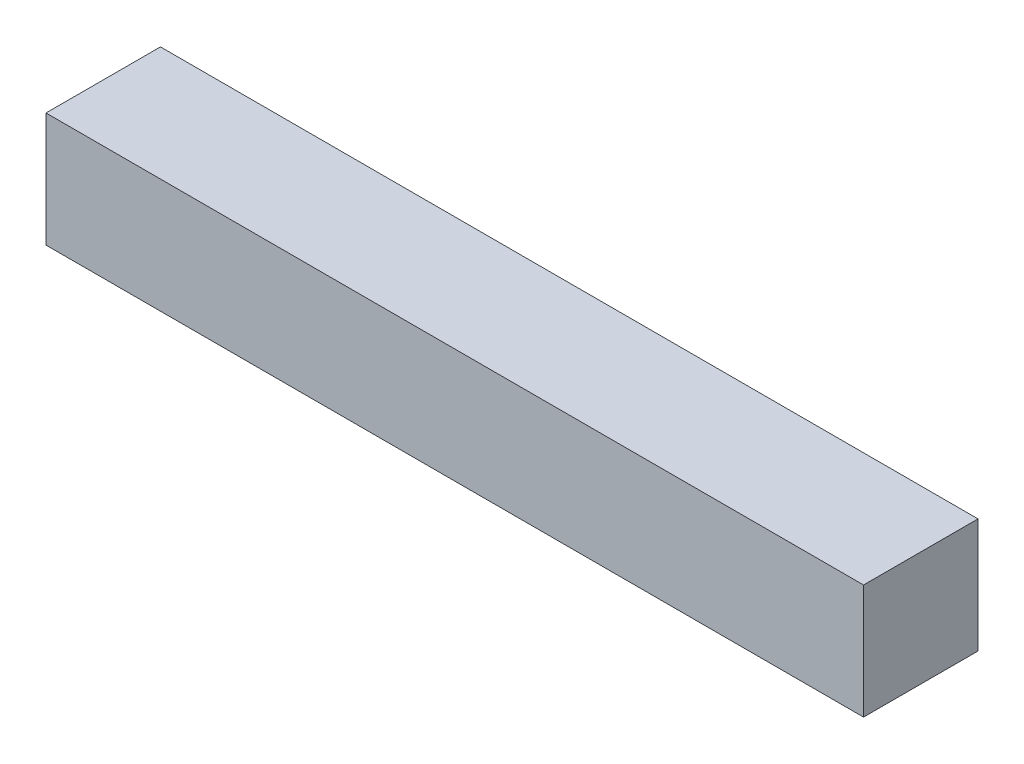
ISO-10303-21;
HEADER;
FILE_DESCRIPTION(('STEP AP214'),'2;1');
FILE_NAME('part.step','',(''),(''),'','','');
FILE_SCHEMA(('AUTOMOTIVE_DESIGN { 1 0 10303 214 1 1 1 1 }'));
ENDSEC;
DATA;
#1=APPLICATION_CONTEXT('core data for automotive mechanical design processes');
#2=APPLICATION_PROTOCOL_DEFINITION('international standard','automotive_design',2000,#1);
#3=PRODUCT_CONTEXT('',#1,'mechanical');
#4=PRODUCT('Part','Part','',(#3));
#5=PRODUCT_RELATED_PRODUCT_CATEGORY('part','',(#4));
#6=PRODUCT_DEFINITION_FORMATION('','',#4);
#7=PRODUCT_DEFINITION_CONTEXT('part definition',#1,'design');
#8=PRODUCT_DEFINITION('design','',#6,#7);
#9=PRODUCT_DEFINITION_SHAPE('','',#8);
#10=(LENGTH_UNIT() NAMED_UNIT(*) SI_UNIT(.MILLI.,.METRE.));
#11=(NAMED_UNIT(*) PLANE_ANGLE_UNIT() SI_UNIT($,.RADIAN.));
#12=(NAMED_UNIT(*) SI_UNIT($,.STERADIAN.) SOLID_ANGLE_UNIT());
#13=UNCERTAINTY_MEASURE_WITH_UNIT(LENGTH_MEASURE(1.E-05),#10,'distance_accuracy_value','');
#14=(GEOMETRIC_REPRESENTATION_CONTEXT(3) GLOBAL_UNCERTAINTY_ASSIGNED_CONTEXT((#13)) GLOBAL_UNIT_ASSIGNED_CONTEXT((#10,
#11,#12)) REPRESENTATION_CONTEXT('',''));
#15=CARTESIAN_POINT('',(0.,0.,0.));
#16=DIRECTION('',(0.,0.,1.));
#17=DIRECTION('',(1.,0.,0.));
#18=AXIS2_PLACEMENT_3D('',#15,#16,#17);
#19=CARTESIAN_POINT('',(-15000.,7000.,7000.));
#20=DIRECTION('',(1.,0.,0.));
#21=DIRECTION('',(0.,0.,-1.));
#22=AXIS2_PLACEMENT_3D('',#19,#20,#21);
#23=PLANE('',#22);
#24=DIRECTION('',(0.,-1.,0.));
#25=VECTOR('',#24,1.);
#26=CARTESIAN_POINT('',(-15000.,7000.,0.));
#27=LINE('',#26,#25);
#28=CARTESIAN_POINT('',(-15000.,7000.,0.));
#29=VERTEX_POINT('',#28);
#30=CARTESIAN_POINT('',(-15000.,0.,0.));
#31=VERTEX_POINT('',#30);
#32=EDGE_CURVE('E271',#29,#31,#27,.T.);
#33=ORIENTED_EDGE('',*,*,#32,.T.);
#34=DIRECTION('',(0.,0.,-1.));
#35=VECTOR('',#34,1.);
#36=CARTESIAN_POINT('',(-15000.,0.,7000.));
#37=LINE('',#36,#35);
#38=CARTESIAN_POINT('',(-15000.,0.,7000.));
#39=VERTEX_POINT('',#38);
#40=EDGE_CURVE('E350',#39,#31,#37,.T.);
#41=ORIENTED_EDGE('',*,*,#40,.F.);
#42=DIRECTION('',(0.,-1.,0.));
#43=VECTOR('',#42,1.);
#44=CARTESIAN_POINT('',(-15000.,7000.,7000.));
#45=LINE('',#44,#43);
#46=CARTESIAN_POINT('',(-15000.,7000.,7000.));
#47=VERTEX_POINT('',#46);
#48=EDGE_CURVE('E275',#47,#39,#45,.T.);
#49=ORIENTED_EDGE('',*,*,#48,.F.);
#50=DIRECTION('',(0.,0.,-1.));
#51=VECTOR('',#50,1.);
#52=CARTESIAN_POINT('',(-15000.,7000.,7000.));
#53=LINE('',#52,#51);
#54=EDGE_CURVE('E346',#47,#29,#53,.T.);
#55=ORIENTED_EDGE('',*,*,#54,.T.);
#56=EDGE_LOOP('',(#33,#41,#49,#55));
#57=FACE_BOUND('',#56,.T.);
#58=ADVANCED_FACE('F50',(#57),#23,.F.);
#59=CARTESIAN_POINT('',(-15000.,0.,7000.));
#60=DIRECTION('',(0.,1.,0.));
#61=DIRECTION('',(0.,0.,1.));
#62=AXIS2_PLACEMENT_3D('',#59,#60,#61);
#63=PLANE('',#62);
#64=DIRECTION('',(1.,0.,0.));
#65=VECTOR('',#64,1.);
#66=CARTESIAN_POINT('',(-15000.,0.,0.));
#67=LINE('',#66,#65);
#68=CARTESIAN_POINT('',(35000.,0.,0.));
#69=VERTEX_POINT('',#68);
#70=EDGE_CURVE('E348',#31,#69,#67,.T.);
#71=ORIENTED_EDGE('',*,*,#70,.T.);
#72=DIRECTION('',(0.,0.,-1.));
#73=VECTOR('',#72,1.);
#74=CARTESIAN_POINT('',(35000.,0.,7000.));
#75=LINE('',#74,#73);
#76=CARTESIAN_POINT('',(35000.,0.,7000.));
#77=VERTEX_POINT('',#76);
#78=EDGE_CURVE('E362',#77,#69,#75,.T.);
#79=ORIENTED_EDGE('',*,*,#78,.F.);
#80=DIRECTION('',(1.,0.,0.));
#81=VECTOR('',#80,1.);
#82=CARTESIAN_POINT('',(-15000.,0.,7000.));
#83=LINE('',#82,#81);
#84=EDGE_CURVE('E97',#39,#77,#83,.T.);
#85=ORIENTED_EDGE('',*,*,#84,.F.);
#86=ORIENTED_EDGE('',*,*,#40,.T.);
#87=EDGE_LOOP('',(#71,#79,#85,#86));
#88=FACE_BOUND('',#87,.T.);
#89=ADVANCED_FACE('F340',(#88),#63,.F.);
#90=CARTESIAN_POINT('',(35000.,0.,7000.));
#91=DIRECTION('',(-1.,0.,0.));
#92=DIRECTION('',(0.,0.,1.));
#93=AXIS2_PLACEMENT_3D('',#90,#91,#92);
#94=PLANE('',#93);
#95=DIRECTION('',(0.,1.,0.));
#96=VECTOR('',#95,1.);
#97=CARTESIAN_POINT('',(35000.,0.,0.));
#98=LINE('',#97,#96);
#99=CARTESIAN_POINT('',(35000.,7000.,0.));
#100=VERTEX_POINT('',#99);
#101=EDGE_CURVE('E355',#69,#100,#98,.T.);
#102=ORIENTED_EDGE('',*,*,#101,.T.);
#103=DIRECTION('',(0.,0.,-1.));
#104=VECTOR('',#103,1.);
#105=CARTESIAN_POINT('',(35000.,7000.,7000.));
#106=LINE('',#105,#104);
#107=CARTESIAN_POINT('',(35000.,7000.,7000.));
#108=VERTEX_POINT('',#107);
#109=EDGE_CURVE('E359',#108,#100,#106,.T.);
#110=ORIENTED_EDGE('',*,*,#109,.F.);
#111=DIRECTION('',(0.,1.,0.));
#112=VECTOR('',#111,1.);
#113=CARTESIAN_POINT('',(35000.,0.,7000.));
#114=LINE('',#113,#112);
#115=EDGE_CURVE('E549',#77,#108,#114,.T.);
#116=ORIENTED_EDGE('',*,*,#115,.F.);
#117=ORIENTED_EDGE('',*,*,#78,.T.);
#118=EDGE_LOOP('',(#102,#110,#116,#117));
#119=FACE_BOUND('',#118,.T.);
#120=ADVANCED_FACE('F345',(#119),#94,.F.);
#121=CARTESIAN_POINT('',(35000.,7000.,7000.));
#122=DIRECTION('',(0.,-1.,0.));
#123=DIRECTION('',(0.,0.,-1.));
#124=AXIS2_PLACEMENT_3D('',#121,#122,#123);
#125=PLANE('',#124);
#126=DIRECTION('',(-1.,0.,0.));
#127=VECTOR('',#126,1.);
#128=CARTESIAN_POINT('',(35000.,7000.,0.));
#129=LINE('',#128,#127);
#130=EDGE_CURVE('E93',#100,#29,#129,.T.);
#131=ORIENTED_EDGE('',*,*,#130,.T.);
#132=ORIENTED_EDGE('',*,*,#54,.F.);
#133=DIRECTION('',(-1.,0.,0.));
#134=VECTOR('',#133,1.);
#135=CARTESIAN_POINT('',(35000.,7000.,7000.));
#136=LINE('',#135,#134);
#137=EDGE_CURVE('E69',#108,#47,#136,.T.);
#138=ORIENTED_EDGE('',*,*,#137,.F.);
#139=ORIENTED_EDGE('',*,*,#109,.T.);
#140=EDGE_LOOP('',(#131,#132,#138,#139));
#141=FACE_BOUND('',#140,.T.);
#142=ADVANCED_FACE('F516',(#141),#125,.F.);
#143=CARTESIAN_POINT('',(0.,0.,7000.));
#144=DIRECTION('',(0.,0.,1.));
#145=DIRECTION('',(1.,0.,0.));
#146=AXIS2_PLACEMENT_3D('',#143,#144,#145);
#147=PLANE('',#146);
#148=ORIENTED_EDGE('',*,*,#48,.T.);
#149=ORIENTED_EDGE('',*,*,#84,.T.);
#150=ORIENTED_EDGE('',*,*,#115,.T.);
#151=ORIENTED_EDGE('',*,*,#137,.T.);
#152=EDGE_LOOP('',(#148,#149,#150,#151));
#153=FACE_BOUND('',#152,.T.);
#154=ADVANCED_FACE('F510',(#153),#147,.T.);
#155=CARTESIAN_POINT('',(0.,0.,0.));
#156=DIRECTION('',(0.,0.,1.));
#157=DIRECTION('',(1.,0.,0.));
#158=AXIS2_PLACEMENT_3D('',#155,#156,#157);
#159=PLANE('',#158);
#160=DIRECTION('',(-0.970201559796527,-0.242299264069014,0.));
#161=VECTOR('',#160,1.);
#162=CARTESIAN_POINT('',(-105.785605771789,423.580979984227,0.));
#163=LINE('',#162,#161);
#164=CARTESIAN_POINT('',(1282.13370336686,770.201559796526,0.));
#165=VERTEX_POINT('',#164);
#166=CARTESIAN_POINT('',(113.655110389649,478.384359236518,0.));
#167=VERTEX_POINT('',#166);
#168=EDGE_CURVE('E386',#165,#167,#163,.T.);
#169=ORIENTED_EDGE('',*,*,#168,.T.);
#170=CARTESIAN_POINT('',(150.,332.854125267039,0.));
#171=DIRECTION('',(0.,0.,1.));
#172=DIRECTION('',(1.,0.,0.));
#173=AXIS2_PLACEMENT_3D('',#170,#171,#172);
#174=CIRCLE('',#173,150.);
#175=CARTESIAN_POINT('',(88.915850741552,469.853127852355,0.));
#176=VERTEX_POINT('',#175);
#177=EDGE_CURVE('E11',#167,#176,#174,.T.);
#178=ORIENTED_EDGE('',*,*,#177,.T.);
#179=DIRECTION('',(0.,-1.,0.));
#180=VECTOR('',#179,1.);
#181=CARTESIAN_POINT('',(88.915850741552,800.,0.));
#182=LINE('',#181,#180);
#183=CARTESIAN_POINT('',(88.915850741552,163.000997414683,0.));
#184=VERTEX_POINT('',#183);
#185=EDGE_CURVE('E53',#184,#176,#182,.F.);
#186=ORIENTED_EDGE('',*,*,#185,.F.);
#187=CARTESIAN_POINT('',(150.,300.,0.));
#188=DIRECTION('',(0.,0.,1.));
#189=DIRECTION('',(1.,0.,0.));
#190=AXIS2_PLACEMENT_3D('',#187,#188,#189);
#191=CIRCLE('',#190,150.);
#192=CARTESIAN_POINT('',(150.,150.,0.));
#193=VERTEX_POINT('',#192);
#194=EDGE_CURVE('E384',#184,#193,#191,.T.);
#195=ORIENTED_EDGE('',*,*,#194,.T.);
#196=DIRECTION('',(1.,0.,0.));
#197=VECTOR('',#196,1.);
#198=CARTESIAN_POINT('',(0.,150.,0.));
#199=LINE('',#198,#197);
#200=CARTESIAN_POINT('',(2183.17892984684,150.,0.));
#201=VERTEX_POINT('',#200);
#202=EDGE_CURVE('E385',#193,#201,#199,.T.);
#203=ORIENTED_EDGE('',*,*,#202,.T.);
#204=CARTESIAN_POINT('',(2183.17892984684,3150.,0.));
#205=DIRECTION('',(0.,0.,1.));
#206=DIRECTION('',(1.,0.,0.));
#207=AXIS2_PLACEMENT_3D('',#204,#205,#206);
#208=CIRCLE('',#207,3000.);
#209=CARTESIAN_POINT('',(2419.35599110079,159.311049985732,0.));
#210=VERTEX_POINT('',#209);
#211=EDGE_CURVE('E377',#201,#210,#208,.T.);
#212=ORIENTED_EDGE('',*,*,#211,.T.);
#213=DIRECTION('',(0.996896316671423,0.0787256870846493,0.));
#214=VECTOR('',#213,1.);
#215=CARTESIAN_POINT('',(2.49157854542202,-31.5506357151004,0.));
#216=LINE('',#215,#214);
#217=CARTESIAN_POINT('',(4876.24751038483,353.333707822309,0.));
#218=VERTEX_POINT('',#217);
#219=EDGE_CURVE('E376',#210,#218,#216,.T.);
#220=ORIENTED_EDGE('',*,*,#219,.T.);
#221=DIRECTION('',(0.,-1.,0.));
#222=VECTOR('',#221,1.);
#223=CARTESIAN_POINT('',(4876.24751038483,800.,0.));
#224=LINE('',#223,#222);
#225=CARTESIAN_POINT('',(4876.24751038483,393.333556509006,0.));
#226=VERTEX_POINT('',#225);
#227=EDGE_CURVE('E372',#226,#218,#224,.T.);
#228=ORIENTED_EDGE('',*,*,#227,.F.);
#229=DIRECTION('',(-0.987755894538212,0.156007348560948,0.));
#230=VECTOR('',#229,1.);
#231=CARTESIAN_POINT('',(179.291130820283,1135.17647046587,0.));
#232=LINE('',#231,#230);
#233=CARTESIAN_POINT('',(2456.49738024797,775.511789076423,0.));
#234=VERTEX_POINT('',#233);
#235=EDGE_CURVE('E369',#226,#234,#232,.T.);
#236=ORIENTED_EDGE('',*,*,#235,.T.);
#237=CARTESIAN_POINT('',(2144.48268312607,-1200.,0.));
#238=DIRECTION('',(0.,0.,1.));
#239=DIRECTION('',(1.,0.,0.));
#240=AXIS2_PLACEMENT_3D('',#237,#238,#239);
#241=CIRCLE('',#240,2000.);
#242=CARTESIAN_POINT('',(2144.48268312607,800.,0.));
#243=VERTEX_POINT('',#242);
#244=EDGE_CURVE('E368',#234,#243,#241,.T.);
#245=ORIENTED_EDGE('',*,*,#244,.T.);
#246=DIRECTION('',(-1.,0.,0.));
#247=VECTOR('',#246,1.);
#248=CARTESIAN_POINT('',(0.,800.,0.));
#249=LINE('',#248,#247);
#250=CARTESIAN_POINT('',(1524.43296743589,800.,0.));
#251=VERTEX_POINT('',#250);
#252=EDGE_CURVE('E375',#243,#251,#249,.T.);
#253=ORIENTED_EDGE('',*,*,#252,.T.);
#254=CARTESIAN_POINT('',(1524.43296743588,-200.,0.));
#255=DIRECTION('',(0.,0.,1.));
#256=DIRECTION('',(1.,0.,0.));
#257=AXIS2_PLACEMENT_3D('',#254,#255,#256);
#258=CIRCLE('',#257,1000.);
#259=EDGE_CURVE('E213',#251,#165,#258,.T.);
#260=ORIENTED_EDGE('',*,*,#259,.T.);
#261=EDGE_LOOP('',(#169,#178,#186,#195,#203,#212,#220,#228,#236,#245,#253,#260));
#262=FACE_BOUND('',#261,.T.);
#263=ORIENTED_EDGE('',*,*,#32,.F.);
#264=ORIENTED_EDGE('',*,*,#130,.F.);
#265=ORIENTED_EDGE('',*,*,#101,.F.);
#266=ORIENTED_EDGE('',*,*,#70,.F.);
#267=EDGE_LOOP('',(#263,#264,#265,#266));
#268=FACE_BOUND('',#267,.T.);
#269=ADVANCED_FACE('F402',(#262,#268),#159,.F.);
#270=CARTESIAN_POINT('',(248.915850741552,800.,0.));
#271=DIRECTION('',(0.,-1.,0.));
#272=DIRECTION('',(0.,0.,-1.));
#273=AXIS2_PLACEMENT_3D('',#270,#271,#272);
#274=CYLINDRICAL_SURFACE('',#273,160.);
#275=ORIENTED_EDGE('',*,*,#185,.T.);
#276=CARTESIAN_POINT('',(113.655110389649,478.384359236518,-85.4665555609618));
#277=CARTESIAN_POINT('',(112.481548775141,478.091251246447,-83.6092670561845));
#278=CARTESIAN_POINT('',(111.346644097831,477.792758019416,-81.7284269553966));
#279=CARTESIAN_POINT('',(109.155539322376,477.190616158341,-77.9222492442464));
#280=CARTESIAN_POINT('',(108.099339287709,476.886967520139,-75.9969115979976));
#281=CARTESIAN_POINT('',(106.066726798449,476.28003794887,-72.1037544888214));
#282=CARTESIAN_POINT('',(105.090338751608,475.976757156024,-70.1359222612503));
#283=CARTESIAN_POINT('',(103.219078804833,475.376092646382,-66.1609856636512));
#284=CARTESIAN_POINT('',(102.324206889226,475.078708928454,-64.1538813011744));
#285=CARTESIAN_POINT('',(100.615155376205,474.494355571979,-60.0979126598209));
#286=CARTESIAN_POINT('',(99.8011893520995,474.207414701507,-58.0489542101899));
#287=CARTESIAN_POINT('',(98.2579649310513,473.649846063953,-53.9172011460308));
#288=CARTESIAN_POINT('',(97.5287058529187,473.379218165696,-51.8344068037553));
#289=CARTESIAN_POINT('',(96.1563301521992,472.859117084361,-47.6382320407094));
#290=CARTESIAN_POINT('',(95.5132051875328,472.60964185351,-45.5248546039078));
#291=CARTESIAN_POINT('',(94.3143584712709,472.136301959897,-41.2706008249891));
#292=CARTESIAN_POINT('',(93.7586366886521,471.912437288045,-39.129724492633));
#293=CARTESIAN_POINT('',(92.734201058544,471.493714068683,-34.8169588640611));
#294=CARTESIAN_POINT('',(92.2657777763377,471.298952800951,-32.6449910275406));
#295=CARTESIAN_POINT('',(91.4193769647117,470.942942652504,-28.2807602607468));
#296=CARTESIAN_POINT('',(91.0413994536701,470.781693778598,-26.0884973263497));
#297=CARTESIAN_POINT('',(90.3769099830872,470.495754350508,-21.6877031685099));
#298=CARTESIAN_POINT('',(90.0904006314539,470.3710648387,-19.4791714830548));
#299=CARTESIAN_POINT('',(89.6096920384309,470.160642293218,-15.0502286552799));
#300=CARTESIAN_POINT('',(89.4154925954417,470.074909174466,-12.8298175389147));
#301=CARTESIAN_POINT('',(89.1202871703629,469.944192772485,-8.38608203623215));
#302=CARTESIAN_POINT('',(89.0190950709365,469.89912811075,-6.16277242290111));
#303=CARTESIAN_POINT('',(88.9095494355952,469.85033130989,-1.7134028572591));
#304=CARTESIAN_POINT('',(88.9011961796687,469.84659929542,0.512657103326271));
#305=CARTESIAN_POINT('',(88.9773519842946,469.88053927644,4.96271330927351));
#306=CARTESIAN_POINT('',(89.0618546528502,469.918208421966,7.18670968614089));
#307=CARTESIAN_POINT('',(89.3234496791945,470.03421396927,11.6281606883902));
#308=CARTESIAN_POINT('',(89.5005408160219,470.112549834776,13.8456153996491));
#309=CARTESIAN_POINT('',(89.9321621045493,470.301956853117,18.1246654421955));
#310=CARTESIAN_POINT('',(90.180864494467,470.410549583801,20.1869618215955));
#311=CARTESIAN_POINT('',(90.7580231251843,470.660101286196,24.2983674646402));
#312=CARTESIAN_POINT('',(91.0864784483613,470.80105988551,26.3474768797332));
#313=CARTESIAN_POINT('',(91.8223683487925,471.113023031167,30.4292401482985));
#314=CARTESIAN_POINT('',(92.2298065529467,471.284028957252,32.4618932416281));
#315=CARTESIAN_POINT('',(93.1227318674805,471.653295725565,36.5074669964445));
#316=CARTESIAN_POINT('',(93.6082188789857,471.851556533266,38.5203876829254));
#317=CARTESIAN_POINT('',(94.6565718524244,472.272288049974,42.5248328398245));
#318=CARTESIAN_POINT('',(95.2194884903989,472.494774594172,44.5163423691311));
#319=CARTESIAN_POINT('',(96.4213890293698,472.960326816393,48.4738685170571));
#320=CARTESIAN_POINT('',(97.0603744864908,473.203392915377,50.4398846132499));
#321=CARTESIAN_POINT('',(98.4131156544516,473.706224503163,54.3432821371033));
#322=CARTESIAN_POINT('',(99.1268525408052,473.965985781319,56.2806706344256));
#323=CARTESIAN_POINT('',(100.628038160787,474.498198486723,60.1247195944822));
#324=CARTESIAN_POINT('',(101.415481149761,474.770648924148,62.0313824384198));
#325=CARTESIAN_POINT('',(103.053431404472,475.32081390248,65.789878090736));
#326=CARTESIAN_POINT('',(103.903101089785,475.598430707961,67.6420903769369));
#327=CARTESIAN_POINT('',(105.67209476984,476.157638898924,71.3118119286049));
#328=CARTESIAN_POINT('',(106.591403065114,476.439229376993,73.1293289008586));
#329=CARTESIAN_POINT('',(108.495734917951,477.001198489011,76.7223038998116));
#330=CARTESIAN_POINT('',(109.480541740212,477.281578141369,78.4978766389943));
#331=CARTESIAN_POINT('',(111.517572665777,477.837629462675,82.0112043076934));
#332=CARTESIAN_POINT('',(112.569811610849,478.11330007814,83.7489507981427));
#333=CARTESIAN_POINT('',(113.655110389649,478.384359236518,85.4665555609618));
#334=B_SPLINE_CURVE_WITH_KNOTS('',3,(#276,#277,#278,#279,#280,#281,#282,#283,#284,#285,#286,
#287,#288,#289,#290,#291,#292,#293,#294,#295,#296,#297,#298,#299,#300,#301,#302,#303,#304,#305,
#306,#307,#308,#309,#310,#311,#312,#313,#314,#315,#316,#317,#318,#319,#320,#321,#322,#323,#324,
#325,#326,#327,#328,#329,#330,#331,#332,#333),.UNSPECIFIED.,.F.,.F.,(4,2,2,2,2,2,2,2,2,2,2,2,2,
2,2,2,2,2,2,2,2,2,2,2,2,2,2,2,4),(0.,6.64887428778499,13.2977539379704,19.948659370851,
26.5995635249058,33.2675826096337,39.9355480683043,46.602867267515,53.2701841001858,
59.9593109336103,66.6484391262357,73.3377580199061,80.0270623044362,86.7029512669012,
93.3788603628692,100.054309932788,106.729671475984,112.96807935669,119.206415462809,
125.445038101686,131.683652837372,137.926370215055,144.169215320706,150.41049206757,
156.651282773596,162.819674438677,168.986679604275,175.134206067186,181.283090275135),.UNSPECIFIED.);
#335=CARTESIAN_POINT('',(113.655110389649,478.384359236518,85.4665555609617));
#336=VERTEX_POINT('',#335);
#337=EDGE_CURVE('E265',#176,#336,#334,.T.);
#338=ORIENTED_EDGE('',*,*,#337,.T.);
#339=CARTESIAN_POINT('',(248.915850741552,512.164533586649,0.));
#340=DIRECTION('',(-0.242299264069014,0.970201559796527,0.));
#341=DIRECTION('',(-0.970201559796527,-0.242299264069014,0.));
#342=AXIS2_PLACEMENT_3D('',#339,#340,#341);
#343=ELLIPSE('',#342,164.914185495182,160.);
#344=CARTESIAN_POINT('',(146.069849075792,486.479653713564,122.567124227366));
#345=VERTEX_POINT('',#344);
#346=EDGE_CURVE('E438',#336,#345,#343,.T.);
#347=ORIENTED_EDGE('',*,*,#346,.T.);
#348=DIRECTION('',(0.,-1.,0.));
#349=VECTOR('',#348,1.);
#350=CARTESIAN_POINT('',(146.069849075792,800.,122.567124227366));
#351=LINE('',#350,#349);
#352=CARTESIAN_POINT('',(146.069849075792,150.05149579368,122.567124227366));
#353=VERTEX_POINT('',#352);
#354=EDGE_CURVE('E259',#345,#353,#351,.T.);
#355=ORIENTED_EDGE('',*,*,#354,.T.);
#356=CARTESIAN_POINT('',(146.069849075792,150.05149579368,122.567124227366));
#357=CARTESIAN_POINT('',(145.225896187737,150.073615862986,121.858965274647));
#358=CARTESIAN_POINT('',(144.389403735078,150.10267037739,121.142208725448));
#359=CARTESIAN_POINT('',(142.731732562761,150.173898990735,119.691878810571));
#360=CARTESIAN_POINT('',(141.910553439385,150.216072743283,118.958305889376));
#361=CARTESIAN_POINT('',(139.470868366272,150.361129926342,116.733201024686));
#362=CARTESIAN_POINT('',(137.875841570126,150.482559716361,115.21696983069));
#363=CARTESIAN_POINT('',(134.753163894521,150.768668470949,112.123624232258));
#364=CARTESIAN_POINT('',(133.225451311803,150.93330682306,110.546568179288));
#365=CARTESIAN_POINT('',(130.238183443832,151.299848120688,107.333236526025));
#366=CARTESIAN_POINT('',(128.778630993244,151.501752614314,105.696958467806));
#367=CARTESIAN_POINT('',(125.931676935866,151.936544202405,102.370309508307));
#368=CARTESIAN_POINT('',(124.544189466091,152.169393192373,100.680007045348));
#369=CARTESIAN_POINT('',(121.841191805207,152.660363289409,97.2461106147451));
#370=CARTESIAN_POINT('',(120.525688743644,152.918486892713,95.5025113949941));
#371=CARTESIAN_POINT('',(117.968237374469,153.454193404723,91.964601104587));
#372=CARTESIAN_POINT('',(116.726302922445,153.731779957634,90.170280574709));
#373=CARTESIAN_POINT('',(114.317781697973,154.30061613028,86.5339001588783));
#374=CARTESIAN_POINT('',(113.151194562145,154.591865684108,84.6918405032186));
#375=CARTESIAN_POINT('',(110.897824733608,155.181587391354,80.9675780900093));
#376=CARTESIAN_POINT('',(109.810835528921,155.480037975042,79.0854968370817));
#377=CARTESIAN_POINT('',(107.714650290854,156.079405738675,75.2790893235231));
#378=CARTESIAN_POINT('',(106.705447961739,156.380322716814,73.3547664979749));
#379=CARTESIAN_POINT('',(104.766102256039,156.979286585441,69.4663235668635));
#380=CARTESIAN_POINT('',(103.835956381895,157.277333566333,67.5022047209694));
#381=CARTESIAN_POINT('',(102.056014725659,157.865370760941,63.5366972442528));
#382=CARTESIAN_POINT('',(101.206218978074,158.155360971196,61.5353085974242));
#383=CARTESIAN_POINT('',(99.5883438109571,158.722260492992,57.4980406642496));
#384=CARTESIAN_POINT('',(98.8202607704063,158.999170383872,55.4621629108929));
#385=CARTESIAN_POINT('',(97.3670981874398,159.535137994833,51.3586713046533));
#386=CARTESIAN_POINT('',(96.6820184537681,159.794195756048,49.2910575249088));
#387=CARTESIAN_POINT('',(95.3961544075052,160.289961127426,45.1270537425637));
#388=CARTESIAN_POINT('',(94.7953724399696,160.526668115759,43.0306629412036));
#389=CARTESIAN_POINT('',(93.6793946591402,160.973560921307,38.8124012031521));
#390=CARTESIAN_POINT('',(93.1641993485658,161.183746582739,36.6905301168728));
#391=CARTESIAN_POINT('',(92.2054815596859,161.580090147205,32.356487055965));
#392=CARTESIAN_POINT('',(91.7647823485292,161.765263152301,30.1435991960532));
#393=CARTESIAN_POINT('',(90.9769971450889,162.099788455264,25.6985091153241));
#394=CARTESIAN_POINT('',(90.6299116592006,162.249140559359,23.4663067900942));
#395=CARTESIAN_POINT('',(90.0303510649592,162.509098243442,18.9869432101127));
#396=CARTESIAN_POINT('',(89.777877113808,162.61970334951,16.739781772737));
#397=CARTESIAN_POINT('',(89.3683152411961,162.799967461146,12.2351431066173));
#398=CARTESIAN_POINT('',(89.2112269898517,162.869626608322,9.97766591357682));
#399=CARTESIAN_POINT('',(88.9929975399224,162.966573670469,5.45852462440302));
#400=CARTESIAN_POINT('',(88.931798748024,162.993887019151,3.1968638589837));
#401=CARTESIAN_POINT('',(88.9053650594043,163.005672372788,-1.32714256143511));
#402=CARTESIAN_POINT('',(88.9401306105545,162.990144177799,-3.58948821958177));
#403=CARTESIAN_POINT('',(89.1055089639775,162.916561534982,-8.10985402745365));
#404=CARTESIAN_POINT('',(89.2361168008861,162.858509290226,-10.3678743951861));
#405=CARTESIAN_POINT('',(89.5927585147658,162.701044450916,-14.87488490689));
#406=CARTESIAN_POINT('',(89.8187908128023,162.601632540717,-17.1238751996554));
#407=CARTESIAN_POINT('',(90.3429801812063,162.37327852936,-21.4228503778689));
#408=CARTESIAN_POINT('',(90.6336330597826,162.247455783682,-23.4739216594459));
#409=CARTESIAN_POINT('',(91.2939301473005,161.964764084953,-27.561119440647));
#410=CARTESIAN_POINT('',(91.6635730265225,161.80789565453,-29.597246191251));
#411=CARTESIAN_POINT('',(92.4809730975262,161.465680222719,-33.6512206894353));
#412=CARTESIAN_POINT('',(92.9287263920883,161.280334642216,-35.6690693436968));
#413=CARTESIAN_POINT('',(93.9013954038357,160.884140870222,-39.6835512615572));
#414=CARTESIAN_POINT('',(94.4263115671196,160.673292531293,-41.680184402432));
#415=CARTESIAN_POINT('',(95.552956526948,160.229164392324,-45.6518215466958));
#416=CARTESIAN_POINT('',(96.1547795676428,159.995857158458,-47.6267957290531));
#417=CARTESIAN_POINT('',(97.433630910992,159.51069618808,-51.5499146356778));
#418=CARTESIAN_POINT('',(98.1106590220711,159.258842498813,-53.4980594282756));
#419=CARTESIAN_POINT('',(99.538782262935,158.74051365247,-57.3649671512542));
#420=CARTESIAN_POINT('',(100.289875495452,158.474038870009,-59.2837308328139));
#421=CARTESIAN_POINT('',(101.865082458927,157.930566690855,-63.0897276306053));
#422=CARTESIAN_POINT('',(102.689202935477,157.653568323443,-64.9769578148825));
#423=CARTESIAN_POINT('',(104.456303458341,157.078057225516,-68.819711214547));
#424=CARTESIAN_POINT('',(105.403318300004,156.779196163741,-70.7733280095368));
#425=CARTESIAN_POINT('',(107.376037897786,156.179762703235,-74.6404280365021));
#426=CARTESIAN_POINT('',(108.401751633397,155.879190112854,-76.5539066569258));
#427=CARTESIAN_POINT('',(110.530581696098,155.281696502486,-80.3382296775498));
#428=CARTESIAN_POINT('',(111.633707914142,154.984775954837,-82.2090685890931));
#429=CARTESIAN_POINT('',(113.915877050779,154.400125158147,-85.9053240855944));
#430=CARTESIAN_POINT('',(115.094919561143,154.112394859699,-87.7307409147313));
#431=CARTESIAN_POINT('',(117.524840972472,153.55234668348,-91.3296578351682));
#432=CARTESIAN_POINT('',(118.775557206226,153.279996489343,-93.1032626927824));
#433=CARTESIAN_POINT('',(121.349511124312,152.755732624533,-96.599903409527));
#434=CARTESIAN_POINT('',(122.672741392116,152.503816870396,-98.3229444126078));
#435=CARTESIAN_POINT('',(125.389551045749,152.026261589838,-101.715157723088));
#436=CARTESIAN_POINT('',(126.783099172462,151.800610532677,-103.384353435242));
#437=CARTESIAN_POINT('',(129.639032745831,151.381314860076,-106.666639713441));
#438=CARTESIAN_POINT('',(131.101408518524,151.187665763808,-108.279738109067));
#439=CARTESIAN_POINT('',(133.655821740112,150.889289293303,-110.984248112761));
#440=CARTESIAN_POINT('',(134.731225491401,150.775112297827,-112.090379610977));
#441=CARTESIAN_POINT('',(136.914396270225,150.567844867437,-114.271846346382));
#442=CARTESIAN_POINT('',(138.022156519602,150.474750051413,-115.347187941403));
#443=CARTESIAN_POINT('',(140.268778276439,150.311753447705,-117.465723562963));
#444=CARTESIAN_POINT('',(141.407626285841,150.241841762145,-118.508931135887));
#445=CARTESIAN_POINT('',(143.716040656992,150.127227399585,-120.562798775275));
#446=CARTESIAN_POINT('',(144.885614606153,150.082531011623,-121.573450662694));
#447=CARTESIAN_POINT('',(146.069849075792,150.05149579368,-122.567124227366));
#448=B_SPLINE_CURVE_WITH_KNOTS('',3,(#356,#357,#358,#359,#360,#361,#362,#363,#364,#365,#366,
#367,#368,#369,#370,#371,#372,#373,#374,#375,#376,#377,#378,#379,#380,#381,#382,#383,#384,#385,
#386,#387,#388,#389,#390,#391,#392,#393,#394,#395,#396,#397,#398,#399,#400,#401,#402,#403,#404,
#405,#406,#407,#408,#409,#410,#411,#412,#413,#414,#415,#416,#417,#418,#419,#420,#421,#422,#423,
#424,#425,#426,#427,#428,#429,#430,#431,#432,#433,#434,#435,#436,#437,#438,#439,#440,#441,#442,
#443,#444,#445,#446,#447),.UNSPECIFIED.,.F.,.F.,(4,2,2,2,2,2,2,2,2,2,2,2,2,2,2,2,2,2,2,2,2,2,2,
2,2,2,2,2,2,2,2,2,2,2,2,2,2,2,2,2,2,2,2,2,2,4),(0.,3.30559604593699,6.61110482002071,
13.2206621164552,19.8240290900284,26.4276704422381,33.0232542588257,39.6194901433589,
46.216964409734,52.8144068558634,59.3940770956331,65.9732142446666,72.5521434676604,
79.1310755161271,85.7097159041363,92.2883411333659,98.867149335237,105.445996178394,
112.235502939955,119.025046428025,125.814672956883,132.604276004225,139.389799501632,
146.175354667559,152.960558314591,159.745649695085,165.970012292596,172.194270117275,
178.418217479313,184.642200825034,190.873885721807,197.105554744543,203.337064177007,
209.56914982083,216.141917856387,222.715436958894,229.289797491092,235.864122673364,
242.424076492287,248.983360625576,255.539754149569,262.095228885801,266.73536063561,
271.374527228182,276.011710603077,280.650050043955),.UNSPECIFIED.);
#449=EDGE_CURVE('E400',#353,#184,#448,.T.);
#450=ORIENTED_EDGE('',*,*,#449,.T.);
#451=EDGE_LOOP('',(#275,#338,#347,#355,#450));
#452=FACE_BOUND('',#451,.T.);
#453=ADVANCED_FACE('F273',(#452),#274,.F.);
#454=CARTESIAN_POINT('',(4846.24751038483,800.,0.));
#455=DIRECTION('',(0.,-1.,0.));
#456=DIRECTION('',(0.,0.,-1.));
#457=AXIS2_PLACEMENT_3D('',#454,#455,#456);
#458=CYLINDRICAL_SURFACE('',#457,30.);
#459=ORIENTED_EDGE('',*,*,#227,.T.);
#460=CARTESIAN_POINT('',(4846.24751038483,350.964584200282,0.));
#461=DIRECTION('',(0.0787256870846493,-0.996896316671423,0.));
#462=DIRECTION('',(-0.996896316671423,-0.0787256870846493,0.));
#463=AXIS2_PLACEMENT_3D('',#460,#461,#462);
#464=ELLIPSE('',#463,30.0934003850753,30.);
#465=CARTESIAN_POINT('',(4854.92200102441,351.649615556391,28.7185168862154));
#466=VERTEX_POINT('',#465);
#467=EDGE_CURVE('E463',#218,#466,#464,.T.);
#468=ORIENTED_EDGE('',*,*,#467,.T.);
#469=DIRECTION('',(0.,-1.,0.));
#470=VECTOR('',#469,1.);
#471=CARTESIAN_POINT('',(4854.92200102441,800.,28.7185168862154));
#472=LINE('',#471,#470);
#473=CARTESIAN_POINT('',(4854.92200102441,396.701732989071,28.7185168862154));
#474=VERTEX_POINT('',#473);
#475=EDGE_CURVE('E234',#474,#466,#472,.T.);
#476=ORIENTED_EDGE('',*,*,#475,.F.);
#477=CARTESIAN_POINT('',(4846.24751038483,398.071792426105,0.));
#478=DIRECTION('',(0.156007348560949,0.987755894538212,0.));
#479=DIRECTION('',(0.987755894538212,-0.156007348560949,0.));
#480=AXIS2_PLACEMENT_3D('',#477,#478,#479);
#481=ELLIPSE('',#480,30.3718764584294,30.);
#482=EDGE_CURVE('E435',#474,#226,#481,.T.);
#483=ORIENTED_EDGE('',*,*,#482,.T.);
#484=EDGE_LOOP('',(#459,#468,#476,#483));
#485=FACE_BOUND('',#484,.T.);
#486=ADVANCED_FACE('F495',(#485),#458,.F.);
#487=CARTESIAN_POINT('',(248.915850741552,800.,0.));
#488=DIRECTION('',(0.,1.,0.));
#489=DIRECTION('',(0.,0.,1.));
#490=AXIS2_PLACEMENT_3D('',#487,#488,#489);
#491=PLANE('',#490);
#492=DIRECTION('',(0.,0.,1.));
#493=VECTOR('',#492,1.);
#494=CARTESIAN_POINT('',(2144.48268312607,800.,-800.));
#495=LINE('',#494,#493);
#496=CARTESIAN_POINT('',(2144.48268312607,800.,795.199241842069));
#497=VERTEX_POINT('',#496);
#498=EDGE_CURVE('E62',#243,#497,#495,.T.);
#499=ORIENTED_EDGE('',*,*,#498,.T.);
#500=CARTESIAN_POINT('',(2005.99085898893,800.,-1200.));
#501=DIRECTION('',(0.,1.,0.));
#502=DIRECTION('',(0.,0.,-1.));
#503=AXIS2_PLACEMENT_3D('',#500,#501,#502);
#504=CIRCLE('',#503,2000.);
#505=CARTESIAN_POINT('',(2005.99085898893,800.,800.));
#506=VERTEX_POINT('',#505);
#507=EDGE_CURVE('E235',#506,#497,#504,.T.);
#508=ORIENTED_EDGE('',*,*,#507,.F.);
#509=DIRECTION('',(1.,0.,0.));
#510=VECTOR('',#509,1.);
#511=CARTESIAN_POINT('',(2005.99085898893,800.,800.));
#512=LINE('',#511,#510);
#513=CARTESIAN_POINT('',(1524.43296743589,800.,800.));
#514=VERTEX_POINT('',#513);
#515=EDGE_CURVE('E224',#514,#506,#512,.T.);
#516=ORIENTED_EDGE('',*,*,#515,.F.);
#517=DIRECTION('',(0.,0.,1.));
#518=VECTOR('',#517,1.);
#519=CARTESIAN_POINT('',(1524.43296743589,800.,-800.));
#520=LINE('',#519,#518);
#521=EDGE_CURVE('E202',#251,#514,#520,.T.);
#522=ORIENTED_EDGE('',*,*,#521,.F.);
#523=ORIENTED_EDGE('',*,*,#252,.F.);
#524=EDGE_LOOP('',(#499,#508,#516,#522,#523));
#525=FACE_BOUND('',#524,.T.);
#526=ADVANCED_FACE('F228',(#525),#491,.F.);
#527=CARTESIAN_POINT('',(113.655110389649,478.384359236518,-800.));
#528=DIRECTION('',(-0.242299264069014,0.970201559796527,0.));
#529=DIRECTION('',(-0.970201559796527,-0.242299264069014,0.));
#530=AXIS2_PLACEMENT_3D('',#527,#528,#529);
#531=PLANE('',#530);
#532=DIRECTION('',(0.,0.,1.));
#533=VECTOR('',#532,1.);
#534=CARTESIAN_POINT('',(1282.13370336686,770.201559796526,-800.));
#535=LINE('',#534,#533);
#536=CARTESIAN_POINT('',(1282.13370336686,770.201559796526,756.572028326072));
#537=VERTEX_POINT('',#536);
#538=EDGE_CURVE('E220',#165,#537,#535,.T.);
#539=ORIENTED_EDGE('',*,*,#538,.T.);
#540=DIRECTION('',(0.914837984276853,0.228472700434691,0.33297400451138));
#541=VECTOR('',#540,1.);
#542=CARTESIAN_POINT('',(1338.6333608178,784.311849851496,777.136234795735));
#543=LINE('',#542,#541);
#544=CARTESIAN_POINT('',(676.455195963192,618.938706088987,536.122941686876));
#545=VERTEX_POINT('',#544);
#546=EDGE_CURVE('E728',#545,#537,#543,.T.);
#547=ORIENTED_EDGE('',*,*,#546,.F.);
#548=CARTESIAN_POINT('',(813.263329140922,653.105328120157,160.24592097874));
#549=DIRECTION('',(-0.242299264069014,0.970201559796527,0.));
#550=DIRECTION('',(-0.970201559796527,-0.242299264069014,0.));
#551=AXIS2_PLACEMENT_3D('',#548,#549,#550);
#552=ELLIPSE('',#551,412.285463737956,400.);
#553=CARTESIAN_POINT('',(556.148324976518,588.893128437442,466.663731547151));
#554=VERTEX_POINT('',#553);
#555=EDGE_CURVE('E730',#554,#545,#552,.T.);
#556=ORIENTED_EDGE('',*,*,#555,.F.);
#557=DIRECTION('',(0.752399129652331,0.187905032268924,0.631337666028591));
#558=VECTOR('',#557,1.);
#559=CARTESIAN_POINT('',(585.994526390826,596.346953433826,491.707661554666));
#560=LINE('',#559,#558);
#561=EDGE_CURVE('E727',#345,#554,#560,.T.);
#562=ORIENTED_EDGE('',*,*,#561,.F.);
#563=ORIENTED_EDGE('',*,*,#346,.F.);
#564=DIRECTION('',(0.,0.,1.));
#565=VECTOR('',#564,1.);
#566=CARTESIAN_POINT('',(113.655110389649,478.384359236518,-800.));
#567=LINE('',#566,#565);
#568=EDGE_CURVE('E399',#167,#336,#567,.T.);
#569=ORIENTED_EDGE('',*,*,#568,.F.);
#570=ORIENTED_EDGE('',*,*,#168,.F.);
#571=EDGE_LOOP('',(#539,#547,#556,#562,#563,#569,#570));
#572=FACE_BOUND('',#571,.T.);
#573=ADVANCED_FACE('F290',(#572),#531,.F.);
#574=CARTESIAN_POINT('',(1524.43296743588,-200.,-800.));
#575=DIRECTION('',(0.,0.,1.));
#576=DIRECTION('',(1.,0.,0.));
#577=AXIS2_PLACEMENT_3D('',#574,#575,#576);
#578=CYLINDRICAL_SURFACE('',#577,1000.);
#579=ORIENTED_EDGE('',*,*,#521,.T.);
#580=CARTESIAN_POINT('',(1524.43296743588,-200.,800.));
#581=DIRECTION('',(0.,0.,1.));
#582=DIRECTION('',(-1.,0.,0.));
#583=AXIS2_PLACEMENT_3D('',#580,#581,#582);
#584=CIRCLE('',#583,1000.);
#585=CARTESIAN_POINT('',(1471.98183389575,798.623491907914,800.));
#586=VERTEX_POINT('',#585);
#587=EDGE_CURVE('E207',#514,#586,#584,.T.);
#588=ORIENTED_EDGE('',*,*,#587,.T.);
#589=CARTESIAN_POINT('',(1335.17370071801,781.927151046052,775.877020708135));
#590=CARTESIAN_POINT('',(1337.89575938453,782.451810878214,776.867768672603));
#591=CARTESIAN_POINT('',(1340.63008421709,782.967088462252,777.829495064699));
#592=CARTESIAN_POINT('',(1346.12224491561,783.978192052347,779.694317937483));
#593=CARTESIAN_POINT('',(1348.88008096093,784.474017909849,780.59741397044));
#594=CARTESIAN_POINT('',(1357.18715037922,785.931255985383,783.21781934171));
#595=CARTESIAN_POINT('',(1362.77005415442,786.862449777875,784.846285685964));
#596=CARTESIAN_POINT('',(1373.96660255791,788.63123939617,787.848329442092));
#597=CARTESIAN_POINT('',(1379.57958734007,789.469560538798,789.223947027615));
#598=CARTESIAN_POINT('',(1390.87195018991,791.056991505616,791.732863975536));
#599=CARTESIAN_POINT('',(1396.55132710273,791.806102879059,792.866167546329));
#600=CARTESIAN_POINT('',(1407.96555864991,793.211162082432,794.886709299959));
#601=CARTESIAN_POINT('',(1413.70041789542,793.86710209659,795.773926845567));
#602=CARTESIAN_POINT('',(1425.21365238405,795.082423294694,797.298946264186));
#603=CARTESIAN_POINT('',(1430.99202766192,795.64180440154,797.936747938045));
#604=CARTESIAN_POINT('',(1439.70703814478,796.408613249258,798.706587480893));
#605=CARTESIAN_POINT('',(1442.6324502408,796.653052587983,798.932611926328));
#606=CARTESIAN_POINT('',(1448.48961013431,797.116460183938,799.320333276916));
#607=CARTESIAN_POINT('',(1451.42135793135,797.335428442937,799.482030186533));
#608=CARTESIAN_POINT('',(1457.28960031602,797.747673216586,799.740871430917));
#609=CARTESIAN_POINT('',(1460.22609507394,797.940948787928,799.838013396066));
#610=CARTESIAN_POINT('',(1466.1021065959,798.301647677181,799.967581942378));
#611=CARTESIAN_POINT('',(1469.04162336872,798.469070919985,800.000008335531));
#612=CARTESIAN_POINT('',(1471.98183389575,798.623491907914,800.));
#613=B_SPLINE_CURVE_WITH_KNOTS('',3,(#589,#590,#591,#592,#593,#594,#595,#596,#597,#598,#599,
#600,#601,#602,#603,#604,#605,#606,#607,#608,#609,#610,#611,#612),.UNSPECIFIED.,.F.,.F.,(4,2,2,
2,2,2,2,2,2,2,2,4),(0.,8.83126931025945,17.6626060526859,35.3249257869307,52.837793920631,
70.3503578744156,87.8643900204625,105.378436151072,114.210648191521,123.042859619124,
131.875395232841,140.707956506758),.UNSPECIFIED.);
#614=CARTESIAN_POINT('',(1335.17370071801,781.927151046052,775.877020708135));
#615=VERTEX_POINT('',#614);
#616=EDGE_CURVE('E299',#615,#586,#613,.T.);
#617=ORIENTED_EDGE('',*,*,#616,.F.);
#618=CARTESIAN_POINT('',(1524.43296743588,-200.,844.761803601959));
#619=DIRECTION('',(0.342020332944328,0.,-0.939692551770339));
#620=DIRECTION('',(0.939692551770339,0.,0.342020332944328));
#621=AXIS2_PLACEMENT_3D('',#618,#619,#620);
#622=ELLIPSE('',#621,1064.17785063428,1000.);
#623=EDGE_CURVE('E308',#537,#615,#622,.T.);
#624=ORIENTED_EDGE('',*,*,#623,.F.);
#625=ORIENTED_EDGE('',*,*,#538,.F.);
#626=ORIENTED_EDGE('',*,*,#259,.F.);
#627=EDGE_LOOP('',(#579,#588,#617,#624,#625,#626));
#628=FACE_BOUND('',#627,.T.);
#629=ADVANCED_FACE('F210',(#628),#578,.F.);
#630=CARTESIAN_POINT('',(150.,332.854125267039,-800.));
#631=DIRECTION('',(0.,0.,1.));
#632=DIRECTION('',(1.,0.,0.));
#633=AXIS2_PLACEMENT_3D('',#630,#631,#632);
#634=CYLINDRICAL_SURFACE('',#633,150.);
#635=ORIENTED_EDGE('',*,*,#568,.T.);
#636=ORIENTED_EDGE('',*,*,#337,.F.);
#637=ORIENTED_EDGE('',*,*,#177,.F.);
#638=EDGE_LOOP('',(#635,#636,#637));
#639=FACE_BOUND('',#638,.T.);
#640=ADVANCED_FACE('F279',(#639),#634,.F.);
#641=CARTESIAN_POINT('',(150.,300.,-800.));
#642=DIRECTION('',(0.,0.,1.));
#643=DIRECTION('',(1.,0.,0.));
#644=AXIS2_PLACEMENT_3D('',#641,#642,#643);
#645=CYLINDRICAL_SURFACE('',#644,150.);
#646=ORIENTED_EDGE('',*,*,#449,.F.);
#647=CARTESIAN_POINT('',(150.,300.,125.8649115504));
#648=DIRECTION('',(0.642787510411007,0.,-0.76604452642103));
#649=DIRECTION('',(0.76604452642103,0.,0.642787510411007));
#650=AXIS2_PLACEMENT_3D('',#647,#648,#649);
#651=ELLIPSE('',#650,195.811072106737,150.);
#652=CARTESIAN_POINT('',(150.,150.,125.864911550401));
#653=VERTEX_POINT('',#652);
#654=EDGE_CURVE('E429',#653,#353,#651,.T.);
#655=ORIENTED_EDGE('',*,*,#654,.F.);
#656=DIRECTION('',(0.,0.,1.));
#657=VECTOR('',#656,1.);
#658=CARTESIAN_POINT('',(150.,150.,-800.));
#659=LINE('',#658,#657);
#660=EDGE_CURVE('E407',#193,#653,#659,.T.);
#661=ORIENTED_EDGE('',*,*,#660,.F.);
#662=ORIENTED_EDGE('',*,*,#194,.F.);
#663=EDGE_LOOP('',(#646,#655,#661,#662));
#664=FACE_BOUND('',#663,.T.);
#665=ADVANCED_FACE('F284',(#664),#645,.F.);
#666=CARTESIAN_POINT('',(2183.17892984684,150.,-800.));
#667=DIRECTION('',(0.,-1.,0.));
#668=DIRECTION('',(1.,0.,0.));
#669=AXIS2_PLACEMENT_3D('',#666,#667,#668);
#670=PLANE('',#669);
#671=ORIENTED_EDGE('',*,*,#660,.T.);
#672=DIRECTION('',(-0.76604452642103,0.,-0.642787510411007));
#673=VECTOR('',#672,1.);
#674=CARTESIAN_POINT('',(556.148324976518,150.,466.663731547151));
#675=LINE('',#674,#673);
#676=CARTESIAN_POINT('',(556.148324976518,150.,466.663731547151));
#677=VERTEX_POINT('',#676);
#678=EDGE_CURVE('E422',#677,#653,#675,.T.);
#679=ORIENTED_EDGE('',*,*,#678,.F.);
#680=CARTESIAN_POINT('',(813.263329140922,150.,160.24592097874));
#681=DIRECTION('',(0.,-1.,0.));
#682=DIRECTION('',(1.,0.,0.));
#683=AXIS2_PLACEMENT_3D('',#680,#681,#682);
#684=CIRCLE('',#683,400.);
#685=CARTESIAN_POINT('',(676.455195963192,150.,536.122941686876));
#686=VERTEX_POINT('',#685);
#687=EDGE_CURVE('E433',#686,#677,#684,.T.);
#688=ORIENTED_EDGE('',*,*,#687,.F.);
#689=DIRECTION('',(-0.939692551770339,0.,-0.342020332944328));
#690=VECTOR('',#689,1.);
#691=CARTESIAN_POINT('',(1335.17370071801,150.,775.877020708135));
#692=LINE('',#691,#690);
#693=CARTESIAN_POINT('',(1335.17370071801,150.,775.877020708135));
#694=VERTEX_POINT('',#693);
#695=EDGE_CURVE('E449',#694,#686,#692,.T.);
#696=ORIENTED_EDGE('',*,*,#695,.F.);
#697=CARTESIAN_POINT('',(1471.98183389575,150.,400.));
#698=DIRECTION('',(0.,-1.,0.));
#699=DIRECTION('',(1.,0.,0.));
#700=AXIS2_PLACEMENT_3D('',#697,#698,#699);
#701=CIRCLE('',#700,400.);
#702=CARTESIAN_POINT('',(1471.98183389575,150.,800.));
#703=VERTEX_POINT('',#702);
#704=EDGE_CURVE('E440',#703,#694,#701,.T.);
#705=ORIENTED_EDGE('',*,*,#704,.F.);
#706=DIRECTION('',(1.,0.,0.));
#707=VECTOR('',#706,1.);
#708=CARTESIAN_POINT('',(2183.17892984684,150.,800.));
#709=LINE('',#708,#707);
#710=CARTESIAN_POINT('',(2005.99085898893,150.,800.));
#711=VERTEX_POINT('',#710);
#712=EDGE_CURVE('E230',#703,#711,#709,.T.);
#713=ORIENTED_EDGE('',*,*,#712,.T.);
#714=CARTESIAN_POINT('',(2005.99085898893,150.,-1200.));
#715=DIRECTION('',(0.,-1.,0.));
#716=DIRECTION('',(1.,0.,0.));
#717=AXIS2_PLACEMENT_3D('',#714,#715,#716);
#718=CIRCLE('',#717,2000.);
#719=CARTESIAN_POINT('',(2183.17892984684,150.,792.135634826517));
#720=VERTEX_POINT('',#719);
#721=EDGE_CURVE('E434',#720,#711,#718,.T.);
#722=ORIENTED_EDGE('',*,*,#721,.F.);
#723=DIRECTION('',(0.,0.,1.));
#724=VECTOR('',#723,1.);
#725=CARTESIAN_POINT('',(2183.17892984684,150.,-800.));
#726=LINE('',#725,#724);
#727=EDGE_CURVE('E419',#201,#720,#726,.T.);
#728=ORIENTED_EDGE('',*,*,#727,.F.);
#729=ORIENTED_EDGE('',*,*,#202,.F.);
#730=EDGE_LOOP('',(#671,#679,#688,#696,#705,#713,#722,#728,#729));
#731=FACE_BOUND('',#730,.T.);
#732=ADVANCED_FACE('F421',(#731),#670,.F.);
#733=CARTESIAN_POINT('',(2183.17892984684,3150.,-800.));
#734=DIRECTION('',(0.,0.,1.));
#735=DIRECTION('',(1.,0.,0.));
#736=AXIS2_PLACEMENT_3D('',#733,#734,#735);
#737=CYLINDRICAL_SURFACE('',#736,3000.);
#738=ORIENTED_EDGE('',*,*,#727,.T.);
#739=CARTESIAN_POINT('',(2419.35599110079,159.311049985732,756.816104684888));
#740=CARTESIAN_POINT('',(2409.62797650755,158.542805285106,758.87110183264));
#741=CARTESIAN_POINT('',(2399.88111871614,157.820863892907,760.854270695236));
#742=CARTESIAN_POINT('',(2380.35262723679,156.470594023458,764.676116591571));
#743=CARTESIAN_POINT('',(2370.57099345617,155.842265795901,766.514793239902));
#744=CARTESIAN_POINT('',(2350.98827706847,154.680965914507,770.044579749408));
#745=CARTESIAN_POINT('',(2341.18723458514,154.147874919953,771.735872913682));
#746=CARTESIAN_POINT('',(2321.55641580356,153.176974275184,774.972744063874));
#747=CARTESIAN_POINT('',(2311.72663952852,152.739164548019,776.518322167473));
#748=CARTESIAN_POINT('',(2292.04133750428,151.959638999459,779.463101397829));
#749=CARTESIAN_POINT('',(2282.18581164245,151.61792359909,780.862301883233));
#750=CARTESIAN_POINT('',(2262.45213329251,151.031310337084,783.513732738586));
#751=CARTESIAN_POINT('',(2252.5739808059,150.786412469007,784.765963118314));
#752=CARTESIAN_POINT('',(2232.78567622343,150.393822579866,787.124434030838));
#753=CARTESIAN_POINT('',(2222.87549947134,150.246253693316,788.230488222294));
#754=CARTESIAN_POINT('',(2203.0387306762,150.049333692804,790.294348368393));
#755=CARTESIAN_POINT('',(2193.11213860504,149.999982747254,791.25215406883));
#756=CARTESIAN_POINT('',(2183.17892984684,150.,792.135634826517));
#757=B_SPLINE_CURVE_WITH_KNOTS('',3,(#739,#740,#741,#742,#743,#744,#745,#746,#747,#748,#749,
#750,#751,#752,#753,#754,#755,#756),.UNSPECIFIED.,.F.,.F.,(4,2,2,2,2,2,2,2,4),(0.,
29.9166426519634,59.8333650988397,89.7123321874936,119.59127514543,149.470349012385,
179.34942089126,209.266221753087,239.183073913146),.UNSPECIFIED.);
#758=CARTESIAN_POINT('',(2419.35599110079,159.311049985732,756.816104684888));
#759=VERTEX_POINT('',#758);
#760=EDGE_CURVE('E460',#759,#720,#757,.T.);
#761=ORIENTED_EDGE('',*,*,#760,.F.);
#762=DIRECTION('',(0.,0.,1.));
#763=VECTOR('',#762,1.);
#764=CARTESIAN_POINT('',(2419.35599110079,159.311049985732,-800.));
#765=LINE('',#764,#763);
#766=EDGE_CURVE('E416',#210,#759,#765,.T.);
#767=ORIENTED_EDGE('',*,*,#766,.F.);
#768=ORIENTED_EDGE('',*,*,#211,.F.);
#769=EDGE_LOOP('',(#738,#761,#767,#768));
#770=FACE_BOUND('',#769,.T.);
#771=ADVANCED_FACE('F466',(#770),#737,.F.);
#772=CARTESIAN_POINT('',(4950.,359.158,-800.));
#773=DIRECTION('',(0.0787256870846493,-0.996896316671423,0.));
#774=DIRECTION('',(0.996896316671423,0.0787256870846493,0.));
#775=AXIS2_PLACEMENT_3D('',#772,#773,#774);
#776=PLANE('',#775);
#777=ORIENTED_EDGE('',*,*,#766,.T.);
#778=CARTESIAN_POINT('',(2005.99085898893,126.66728001876,-1200.));
#779=DIRECTION('',(0.0787256870846493,-0.996896316671423,0.));
#780=DIRECTION('',(-0.996896316671423,-0.0787256870846493,0.));
#781=AXIS2_PLACEMENT_3D('',#778,#779,#780);
#782=ELLIPSE('',#781,2006.22669233835,2000.);
#783=CARTESIAN_POINT('',(2584.290234961,172.336037092753,714.567792414336));
#784=VERTEX_POINT('',#783);
#785=EDGE_CURVE('E231',#784,#759,#782,.T.);
#786=ORIENTED_EDGE('',*,*,#785,.F.);
#787=DIRECTION('',(-0.954560137877115,-0.0753823657097153,0.28832697084392));
#788=VECTOR('',#787,1.);
#789=CARTESIAN_POINT('',(4887.18395026792,354.19736709124,18.9737247774777));
#790=LINE('',#789,#788);
#791=EDGE_CURVE('E236',#466,#784,#790,.T.);
#792=ORIENTED_EDGE('',*,*,#791,.F.);
#793=ORIENTED_EDGE('',*,*,#467,.F.);
#794=ORIENTED_EDGE('',*,*,#219,.F.);
#795=EDGE_LOOP('',(#777,#786,#792,#793,#794));
#796=FACE_BOUND('',#795,.T.);
#797=ADVANCED_FACE('F472',(#796),#776,.F.);
#798=CARTESIAN_POINT('',(2456.49738024797,775.511789076423,-800.));
#799=DIRECTION('',(0.156007348560949,0.987755894538212,0.));
#800=DIRECTION('',(-0.987755894538212,0.156007348560949,0.));
#801=AXIS2_PLACEMENT_3D('',#798,#799,#800);
#802=PLANE('',#801);
#803=ORIENTED_EDGE('',*,*,#482,.F.);
#804=DIRECTION('',(0.946526328203871,-0.149495501492554,-0.285900341116248));
#805=VECTOR('',#804,1.);
#806=CARTESIAN_POINT('',(4797.85472028778,405.715007631657,45.9558134547544));
#807=LINE('',#806,#805);
#808=CARTESIAN_POINT('',(2584.290234961,755.328032604754,714.567792414336));
#809=VERTEX_POINT('',#808);
#810=EDGE_CURVE('E451',#809,#474,#807,.T.);
#811=ORIENTED_EDGE('',*,*,#810,.F.);
#812=CARTESIAN_POINT('',(2005.99085898893,846.665328407006,-1200.));
#813=DIRECTION('',(0.156007348560949,0.987755894538212,0.));
#814=DIRECTION('',(0.987755894538212,-0.156007348560949,0.));
#815=AXIS2_PLACEMENT_3D('',#812,#813,#814);
#816=ELLIPSE('',#815,2024.79176389529,2000.);
#817=CARTESIAN_POINT('',(2456.49738024797,775.511789076423,748.600491199537));
#818=VERTEX_POINT('',#817);
#819=EDGE_CURVE('E454',#818,#809,#816,.T.);
#820=ORIENTED_EDGE('',*,*,#819,.F.);
#821=DIRECTION('',(0.,0.,1.));
#822=VECTOR('',#821,1.);
#823=CARTESIAN_POINT('',(2456.49738024797,775.511789076423,-800.));
#824=LINE('',#823,#822);
#825=EDGE_CURVE('E217',#234,#818,#824,.T.);
#826=ORIENTED_EDGE('',*,*,#825,.F.);
#827=ORIENTED_EDGE('',*,*,#235,.F.);
#828=EDGE_LOOP('',(#803,#811,#820,#826,#827));
#829=FACE_BOUND('',#828,.T.);
#830=ADVANCED_FACE('F331',(#829),#802,.F.);
#831=CARTESIAN_POINT('',(2144.48268312607,-1200.,-800.));
#832=DIRECTION('',(0.,0.,1.));
#833=DIRECTION('',(1.,0.,0.));
#834=AXIS2_PLACEMENT_3D('',#831,#832,#833);
#835=CYLINDRICAL_SURFACE('',#834,2000.);
#836=ORIENTED_EDGE('',*,*,#825,.T.);
#837=CARTESIAN_POINT('',(2144.48268312607,800.,795.199241842069));
#838=CARTESIAN_POINT('',(2151.08233996625,800.000002353583,794.741145342208));
#839=CARTESIAN_POINT('',(2157.67963388099,799.967332518524,794.25030425949));
#840=CARTESIAN_POINT('',(2170.86838063385,799.836814431239,793.203241538487));
#841=CARTESIAN_POINT('',(2177.45983347703,799.738966235441,792.647019956806));
#842=CARTESIAN_POINT('',(2197.22333857604,799.347911591079,790.880485085643));
#843=CARTESIAN_POINT('',(2210.38497444474,798.957195063586,789.572271329634));
#844=CARTESIAN_POINT('',(2236.63000487784,797.919125430276,786.70061455856));
#845=CARTESIAN_POINT('',(2249.71351571177,797.272545622913,785.137948875447));
#846=CARTESIAN_POINT('',(2275.83234645416,795.725033759422,781.756537974986));
#847=CARTESIAN_POINT('',(2288.8676663574,794.824101675717,779.937792729874));
#848=CARTESIAN_POINT('',(2314.88015122526,792.770663133569,776.046646491113));
#849=CARTESIAN_POINT('',(2327.85731760994,791.618162852699,773.974251726696));
#850=CARTESIAN_POINT('',(2353.74454256704,789.064766449564,769.578570939847));
#851=CARTESIAN_POINT('',(2366.65460081853,787.663869140481,767.255283718694));
#852=CARTESIAN_POINT('',(2392.43758810509,784.612653471285,762.353595765767));
#853=CARTESIAN_POINT('',(2405.31028800418,782.961596184812,759.774447329787));
#854=CARTESIAN_POINT('',(2424.5550045665,780.303370063568,755.721615881246));
#855=CARTESIAN_POINT('',(2430.95921339951,779.38701728979,754.339981362318));
#856=CARTESIAN_POINT('',(2443.74527736164,777.494289752338,751.515804162936));
#857=CARTESIAN_POINT('',(2450.12713254395,776.517915131535,750.073261627465));
#858=CARTESIAN_POINT('',(2456.49738024797,775.511789076424,748.600491199537));
#859=B_SPLINE_CURVE_WITH_KNOTS('',3,(#837,#838,#839,#840,#841,#842,#843,#844,#845,#846,#847,
#848,#849,#850,#851,#852,#853,#854,#855,#856,#857,#858),.UNSPECIFIED.,.F.,.F.,(4,2,2,2,2,2,2,2,
2,2,4),(0.,19.8462686399496,39.6925200978424,79.3837091928708,118.955844296198,158.527983690061,
198.099151449761,237.670508282028,277.361116325358,297.206579350839,317.051995140006),.UNSPECIFIED.);
#860=EDGE_CURVE('E307',#497,#818,#859,.T.);
#861=ORIENTED_EDGE('',*,*,#860,.F.);
#862=ORIENTED_EDGE('',*,*,#498,.F.);
#863=ORIENTED_EDGE('',*,*,#244,.F.);
#864=EDGE_LOOP('',(#836,#861,#862,#863));
#865=FACE_BOUND('',#864,.T.);
#866=ADVANCED_FACE('F294',(#865),#835,.F.);
#867=CARTESIAN_POINT('',(556.148324976518,800.,466.663731547151));
#868=DIRECTION('',(0.642787510411007,0.,-0.76604452642103));
#869=DIRECTION('',(-0.76604452642103,0.,-0.642787510411007));
#870=AXIS2_PLACEMENT_3D('',#867,#868,#869);
#871=PLANE('',#870);
#872=ORIENTED_EDGE('',*,*,#678,.T.);
#873=ORIENTED_EDGE('',*,*,#654,.T.);
#874=ORIENTED_EDGE('',*,*,#354,.F.);
#875=ORIENTED_EDGE('',*,*,#561,.T.);
#876=DIRECTION('',(0.,-1.,0.));
#877=VECTOR('',#876,1.);
#878=CARTESIAN_POINT('',(556.148324976518,800.,466.663731547151));
#879=LINE('',#878,#877);
#880=EDGE_CURVE('E258',#554,#677,#879,.T.);
#881=ORIENTED_EDGE('',*,*,#880,.T.);
#882=EDGE_LOOP('',(#872,#873,#874,#875,#881));
#883=FACE_BOUND('',#882,.T.);
#884=ADVANCED_FACE('F327',(#883),#871,.T.);
#885=CARTESIAN_POINT('',(813.263329140922,800.,160.24592097874));
#886=DIRECTION('',(0.,-1.,0.));
#887=DIRECTION('',(0.,0.,-1.));
#888=AXIS2_PLACEMENT_3D('',#885,#886,#887);
#889=CYLINDRICAL_SURFACE('',#888,400.);
#890=ORIENTED_EDGE('',*,*,#687,.T.);
#891=ORIENTED_EDGE('',*,*,#880,.F.);
#892=ORIENTED_EDGE('',*,*,#555,.T.);
#893=DIRECTION('',(0.,-1.,0.));
#894=VECTOR('',#893,1.);
#895=CARTESIAN_POINT('',(676.455195963192,800.,536.122941686876));
#896=LINE('',#895,#894);
#897=EDGE_CURVE('E251',#545,#686,#896,.T.);
#898=ORIENTED_EDGE('',*,*,#897,.T.);
#899=EDGE_LOOP('',(#890,#891,#892,#898));
#900=FACE_BOUND('',#899,.T.);
#901=ADVANCED_FACE('F324',(#900),#889,.F.);
#902=CARTESIAN_POINT('',(1335.17370071801,800.,775.877020708135));
#903=DIRECTION('',(0.342020332944328,0.,-0.939692551770339));
#904=DIRECTION('',(-0.939692551770339,0.,-0.342020332944328));
#905=AXIS2_PLACEMENT_3D('',#902,#903,#904);
#906=PLANE('',#905);
#907=ORIENTED_EDGE('',*,*,#695,.T.);
#908=ORIENTED_EDGE('',*,*,#897,.F.);
#909=ORIENTED_EDGE('',*,*,#546,.T.);
#910=ORIENTED_EDGE('',*,*,#623,.T.);
#911=DIRECTION('',(0.,-1.,0.));
#912=VECTOR('',#911,1.);
#913=CARTESIAN_POINT('',(1335.17370071801,800.,775.877020708135));
#914=LINE('',#913,#912);
#915=EDGE_CURVE('E249',#615,#694,#914,.T.);
#916=ORIENTED_EDGE('',*,*,#915,.T.);
#917=EDGE_LOOP('',(#907,#908,#909,#910,#916));
#918=FACE_BOUND('',#917,.T.);
#919=ADVANCED_FACE('F321',(#918),#906,.T.);
#920=CARTESIAN_POINT('',(1471.98183389575,800.,400.));
#921=DIRECTION('',(0.,-1.,0.));
#922=DIRECTION('',(0.,0.,-1.));
#923=AXIS2_PLACEMENT_3D('',#920,#921,#922);
#924=CYLINDRICAL_SURFACE('',#923,400.);
#925=ORIENTED_EDGE('',*,*,#704,.T.);
#926=ORIENTED_EDGE('',*,*,#915,.F.);
#927=ORIENTED_EDGE('',*,*,#616,.T.);
#928=DIRECTION('',(0.,-1.,0.));
#929=VECTOR('',#928,1.);
#930=CARTESIAN_POINT('',(1471.98183389575,800.,800.));
#931=LINE('',#930,#929);
#932=EDGE_CURVE('E227',#586,#703,#931,.T.);
#933=ORIENTED_EDGE('',*,*,#932,.T.);
#934=EDGE_LOOP('',(#925,#926,#927,#933));
#935=FACE_BOUND('',#934,.T.);
#936=ADVANCED_FACE('F312',(#935),#924,.F.);
#937=CARTESIAN_POINT('',(2005.99085898893,800.,-1200.));
#938=DIRECTION('',(0.,-1.,0.));
#939=DIRECTION('',(0.,0.,-1.));
#940=AXIS2_PLACEMENT_3D('',#937,#938,#939);
#941=CYLINDRICAL_SURFACE('',#940,2000.);
#942=ORIENTED_EDGE('',*,*,#785,.T.);
#943=ORIENTED_EDGE('',*,*,#760,.T.);
#944=ORIENTED_EDGE('',*,*,#721,.T.);
#945=DIRECTION('',(0.,-1.,0.));
#946=VECTOR('',#945,1.);
#947=CARTESIAN_POINT('',(2005.99085898893,800.,800.));
#948=LINE('',#947,#946);
#949=EDGE_CURVE('E250',#506,#711,#948,.T.);
#950=ORIENTED_EDGE('',*,*,#949,.F.);
#951=ORIENTED_EDGE('',*,*,#507,.T.);
#952=ORIENTED_EDGE('',*,*,#860,.T.);
#953=ORIENTED_EDGE('',*,*,#819,.T.);
#954=DIRECTION('',(0.,-1.,0.));
#955=VECTOR('',#954,1.);
#956=CARTESIAN_POINT('',(2584.290234961,800.,714.567792414336));
#957=LINE('',#956,#955);
#958=EDGE_CURVE('E241',#809,#784,#957,.T.);
#959=ORIENTED_EDGE('',*,*,#958,.T.);
#960=EDGE_LOOP('',(#942,#943,#944,#950,#951,#952,#953,#959));
#961=FACE_BOUND('',#960,.T.);
#962=ADVANCED_FACE('F319',(#961),#941,.F.);
#963=CARTESIAN_POINT('',(4854.92200102441,800.,28.7185168862154));
#964=DIRECTION('',(-0.289149687986038,0.,-0.957283896207168));
#965=DIRECTION('',(-0.957283896207168,0.,0.289149687986038));
#966=AXIS2_PLACEMENT_3D('',#963,#964,#965);
#967=PLANE('',#966);
#968=ORIENTED_EDGE('',*,*,#791,.T.);
#969=ORIENTED_EDGE('',*,*,#958,.F.);
#970=ORIENTED_EDGE('',*,*,#810,.T.);
#971=ORIENTED_EDGE('',*,*,#475,.T.);
#972=EDGE_LOOP('',(#968,#969,#970,#971));
#973=FACE_BOUND('',#972,.T.);
#974=ADVANCED_FACE('F668',(#973),#967,.T.);
#975=CARTESIAN_POINT('',(2005.99085898893,800.,800.));
#976=DIRECTION('',(0.,0.,-1.));
#977=DIRECTION('',(-1.,0.,0.));
#978=AXIS2_PLACEMENT_3D('',#975,#976,#977);
#979=PLANE('',#978);
#980=ORIENTED_EDGE('',*,*,#932,.F.);
#981=ORIENTED_EDGE('',*,*,#587,.F.);
#982=ORIENTED_EDGE('',*,*,#515,.T.);
#983=ORIENTED_EDGE('',*,*,#949,.T.);
#984=ORIENTED_EDGE('',*,*,#712,.F.);
#985=EDGE_LOOP('',(#980,#981,#982,#983,#984));
#986=FACE_BOUND('',#985,.T.);
#987=ADVANCED_FACE('F222',(#986),#979,.T.);
#988=CLOSED_SHELL('',(#58,#89,#120,#142,#154,#269,#453,#486,#526,#573,#629,#640,#665,#732,#771,
#797,#830,#866,#884,#901,#919,#936,#962,#974,#987));
#989=MANIFOLD_SOLID_BREP('B2',#988);
#990=ADVANCED_BREP_SHAPE_REPRESENTATION('',(#18,#989),#14);
#991=SHAPE_DEFINITION_REPRESENTATION(#9,#990);
ENDSEC;
END-ISO-10303-21;
